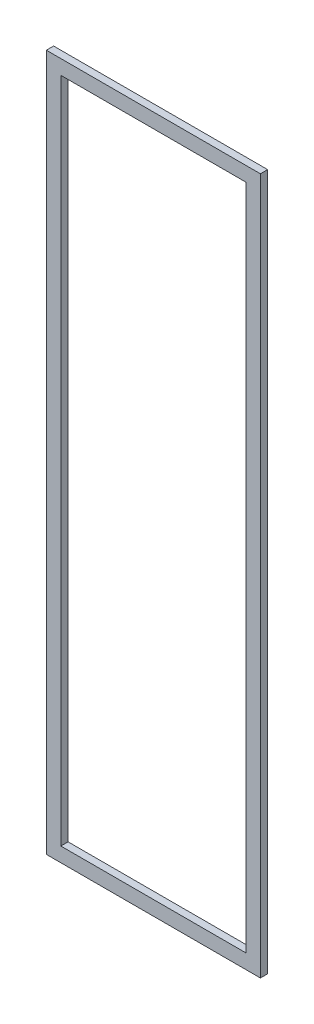
ISO-10303-21;
HEADER;
FILE_DESCRIPTION(('STEP AP214'),'2;1');
FILE_NAME('part.step','',(''),(''),'','','');
FILE_SCHEMA(('AUTOMOTIVE_DESIGN { 1 0 10303 214 1 1 1 1 }'));
ENDSEC;
DATA;
#1=APPLICATION_CONTEXT('core data for automotive mechanical design processes');
#2=APPLICATION_PROTOCOL_DEFINITION('international standard','automotive_design',2000,#1);
#3=PRODUCT_CONTEXT('',#1,'mechanical');
#4=PRODUCT('Part','Part','',(#3));
#5=PRODUCT_RELATED_PRODUCT_CATEGORY('part','',(#4));
#6=PRODUCT_DEFINITION_FORMATION('','',#4);
#7=PRODUCT_DEFINITION_CONTEXT('part definition',#1,'design');
#8=PRODUCT_DEFINITION('design','',#6,#7);
#9=PRODUCT_DEFINITION_SHAPE('','',#8);
#10=(LENGTH_UNIT() NAMED_UNIT(*) SI_UNIT(.MILLI.,.METRE.));
#11=(NAMED_UNIT(*) PLANE_ANGLE_UNIT() SI_UNIT($,.RADIAN.));
#12=(NAMED_UNIT(*) SI_UNIT($,.STERADIAN.) SOLID_ANGLE_UNIT());
#13=UNCERTAINTY_MEASURE_WITH_UNIT(LENGTH_MEASURE(1.E-05),#10,'distance_accuracy_value','');
#14=(GEOMETRIC_REPRESENTATION_CONTEXT(3) GLOBAL_UNCERTAINTY_ASSIGNED_CONTEXT((#13)) GLOBAL_UNIT_ASSIGNED_CONTEXT((#10,
#11,#12)) REPRESENTATION_CONTEXT('',''));
#15=CARTESIAN_POINT('',(0.,0.,0.));
#16=DIRECTION('',(0.,0.,1.));
#17=DIRECTION('',(1.,0.,0.));
#18=AXIS2_PLACEMENT_3D('',#15,#16,#17);
#19=CARTESIAN_POINT('',(0.,0.,25.4));
#20=DIRECTION('',(0.,0.,1.));
#21=DIRECTION('',(1.,0.,0.));
#22=AXIS2_PLACEMENT_3D('',#19,#20,#21);
#23=PLANE('',#22);
#24=DIRECTION('',(0.,-1.,0.));
#25=VECTOR('',#24,1.);
#26=CARTESIAN_POINT('',(0.,0.,25.4));
#27=LINE('',#26,#25);
#28=CARTESIAN_POINT('',(0.,0.,25.4));
#29=VERTEX_POINT('',#28);
#30=CARTESIAN_POINT('',(2.98813818991954E-13,-2440.,25.4));
#31=VERTEX_POINT('',#30);
#32=EDGE_CURVE('E136',#29,#31,#27,.T.);
#33=ORIENTED_EDGE('',*,*,#32,.T.);
#34=DIRECTION('',(1.,0.,0.));
#35=VECTOR('',#34,1.);
#36=CARTESIAN_POINT('',(2.98813818991954E-13,-2440.,25.4));
#37=LINE('',#36,#35);
#38=CARTESIAN_POINT('',(750.,-2440.,25.4));
#39=VERTEX_POINT('',#38);
#40=EDGE_CURVE('E139',#31,#39,#37,.T.);
#41=ORIENTED_EDGE('',*,*,#40,.T.);
#42=DIRECTION('',(0.,1.,0.));
#43=VECTOR('',#42,1.);
#44=CARTESIAN_POINT('',(750.,0.,25.4));
#45=LINE('',#44,#43);
#46=CARTESIAN_POINT('',(750.,0.,25.4));
#47=VERTEX_POINT('',#46);
#48=EDGE_CURVE('E142',#39,#47,#45,.T.);
#49=ORIENTED_EDGE('',*,*,#48,.T.);
#50=DIRECTION('',(-1.,0.,0.));
#51=VECTOR('',#50,1.);
#52=CARTESIAN_POINT('',(0.,0.,25.4));
#53=LINE('',#52,#51);
#54=EDGE_CURVE('E144',#47,#29,#53,.T.);
#55=ORIENTED_EDGE('',*,*,#54,.T.);
#56=EDGE_LOOP('',(#33,#41,#49,#55));
#57=FACE_BOUND('',#56,.T.);
#58=DIRECTION('',(1.,0.,0.));
#59=VECTOR('',#58,1.);
#60=CARTESIAN_POINT('',(50.8000000000003,-2389.2,25.4));
#61=LINE('',#60,#59);
#62=CARTESIAN_POINT('',(50.8000000000003,-2389.2,25.4));
#63=VERTEX_POINT('',#62);
#64=CARTESIAN_POINT('',(699.2,-2389.2,25.4));
#65=VERTEX_POINT('',#64);
#66=EDGE_CURVE('E108',#63,#65,#61,.T.);
#67=ORIENTED_EDGE('',*,*,#66,.F.);
#68=DIRECTION('',(0.,-1.,0.));
#69=VECTOR('',#68,1.);
#70=CARTESIAN_POINT('',(50.8,-50.8,25.4));
#71=LINE('',#70,#69);
#72=CARTESIAN_POINT('',(50.8,-50.8,25.4));
#73=VERTEX_POINT('',#72);
#74=EDGE_CURVE('E100',#73,#63,#71,.T.);
#75=ORIENTED_EDGE('',*,*,#74,.F.);
#76=DIRECTION('',(-1.,0.,0.));
#77=VECTOR('',#76,1.);
#78=CARTESIAN_POINT('',(50.8,-50.8,25.4));
#79=LINE('',#78,#77);
#80=CARTESIAN_POINT('',(699.2,-50.8,25.4));
#81=VERTEX_POINT('',#80);
#82=EDGE_CURVE('E122',#81,#73,#79,.T.);
#83=ORIENTED_EDGE('',*,*,#82,.F.);
#84=DIRECTION('',(0.,1.,0.));
#85=VECTOR('',#84,1.);
#86=CARTESIAN_POINT('',(699.2,-50.8,25.4));
#87=LINE('',#86,#85);
#88=EDGE_CURVE('E120',#65,#81,#87,.T.);
#89=ORIENTED_EDGE('',*,*,#88,.F.);
#90=EDGE_LOOP('',(#67,#75,#83,#89));
#91=FACE_BOUND('',#90,.T.);
#92=ADVANCED_FACE('F35',(#57,#91),#23,.T.);
#93=CARTESIAN_POINT('',(0.,0.,0.));
#94=DIRECTION('',(0.,0.,1.));
#95=DIRECTION('',(1.,0.,0.));
#96=AXIS2_PLACEMENT_3D('',#93,#94,#95);
#97=PLANE('',#96);
#98=DIRECTION('',(0.,-1.,0.));
#99=VECTOR('',#98,1.);
#100=CARTESIAN_POINT('',(0.,0.,0.));
#101=LINE('',#100,#99);
#102=CARTESIAN_POINT('',(0.,0.,0.));
#103=VERTEX_POINT('',#102);
#104=CARTESIAN_POINT('',(2.98813818991954E-13,-2440.,0.));
#105=VERTEX_POINT('',#104);
#106=EDGE_CURVE('E116',#103,#105,#101,.T.);
#107=ORIENTED_EDGE('',*,*,#106,.F.);
#108=DIRECTION('',(-1.,0.,0.));
#109=VECTOR('',#108,1.);
#110=CARTESIAN_POINT('',(0.,0.,0.));
#111=LINE('',#110,#109);
#112=CARTESIAN_POINT('',(750.,0.,0.));
#113=VERTEX_POINT('',#112);
#114=EDGE_CURVE('E140',#113,#103,#111,.T.);
#115=ORIENTED_EDGE('',*,*,#114,.F.);
#116=DIRECTION('',(0.,1.,0.));
#117=VECTOR('',#116,1.);
#118=CARTESIAN_POINT('',(750.,0.,0.));
#119=LINE('',#118,#117);
#120=CARTESIAN_POINT('',(750.,-2440.,0.));
#121=VERTEX_POINT('',#120);
#122=EDGE_CURVE('E151',#121,#113,#119,.T.);
#123=ORIENTED_EDGE('',*,*,#122,.F.);
#124=DIRECTION('',(1.,0.,0.));
#125=VECTOR('',#124,1.);
#126=CARTESIAN_POINT('',(2.98813818991954E-13,-2440.,0.));
#127=LINE('',#126,#125);
#128=EDGE_CURVE('E149',#105,#121,#127,.T.);
#129=ORIENTED_EDGE('',*,*,#128,.F.);
#130=EDGE_LOOP('',(#107,#115,#123,#129));
#131=FACE_BOUND('',#130,.T.);
#132=DIRECTION('',(0.,-1.,0.));
#133=VECTOR('',#132,1.);
#134=CARTESIAN_POINT('',(50.8,-50.8,0.));
#135=LINE('',#134,#133);
#136=CARTESIAN_POINT('',(50.8,-50.8,0.));
#137=VERTEX_POINT('',#136);
#138=CARTESIAN_POINT('',(50.8000000000003,-2389.2,0.));
#139=VERTEX_POINT('',#138);
#140=EDGE_CURVE('E58',#137,#139,#135,.T.);
#141=ORIENTED_EDGE('',*,*,#140,.T.);
#142=DIRECTION('',(1.,0.,0.));
#143=VECTOR('',#142,1.);
#144=CARTESIAN_POINT('',(50.8000000000003,-2389.2,0.));
#145=LINE('',#144,#143);
#146=CARTESIAN_POINT('',(699.2,-2389.2,0.));
#147=VERTEX_POINT('',#146);
#148=EDGE_CURVE('E115',#139,#147,#145,.T.);
#149=ORIENTED_EDGE('',*,*,#148,.T.);
#150=DIRECTION('',(0.,1.,0.));
#151=VECTOR('',#150,1.);
#152=CARTESIAN_POINT('',(699.2,-50.8,0.));
#153=LINE('',#152,#151);
#154=CARTESIAN_POINT('',(699.2,-50.8,0.));
#155=VERTEX_POINT('',#154);
#156=EDGE_CURVE('E128',#147,#155,#153,.T.);
#157=ORIENTED_EDGE('',*,*,#156,.T.);
#158=DIRECTION('',(-1.,0.,0.));
#159=VECTOR('',#158,1.);
#160=CARTESIAN_POINT('',(50.8,-50.8,0.));
#161=LINE('',#160,#159);
#162=EDGE_CURVE('E109',#155,#137,#161,.T.);
#163=ORIENTED_EDGE('',*,*,#162,.T.);
#164=EDGE_LOOP('',(#141,#149,#157,#163));
#165=FACE_BOUND('',#164,.T.);
#166=ADVANCED_FACE('F169',(#131,#165),#97,.F.);
#167=CARTESIAN_POINT('',(0.,0.,25.4));
#168=DIRECTION('',(1.,0.,0.));
#169=DIRECTION('',(0.,1.,0.));
#170=AXIS2_PLACEMENT_3D('',#167,#168,#169);
#171=PLANE('',#170);
#172=ORIENTED_EDGE('',*,*,#106,.T.);
#173=DIRECTION('',(0.,0.,-1.));
#174=VECTOR('',#173,1.);
#175=CARTESIAN_POINT('',(2.98813818991954E-13,-2440.,25.4));
#176=LINE('',#175,#174);
#177=EDGE_CURVE('E11',#31,#105,#176,.T.);
#178=ORIENTED_EDGE('',*,*,#177,.F.);
#179=ORIENTED_EDGE('',*,*,#32,.F.);
#180=DIRECTION('',(0.,0.,-1.));
#181=VECTOR('',#180,1.);
#182=CARTESIAN_POINT('',(0.,0.,25.4));
#183=LINE('',#182,#181);
#184=EDGE_CURVE('E146',#29,#103,#183,.T.);
#185=ORIENTED_EDGE('',*,*,#184,.T.);
#186=EDGE_LOOP('',(#172,#178,#179,#185));
#187=FACE_BOUND('',#186,.T.);
#188=ADVANCED_FACE('F37',(#187),#171,.F.);
#189=CARTESIAN_POINT('',(2.98813818991954E-13,-2440.,25.4));
#190=DIRECTION('',(0.,1.,0.));
#191=DIRECTION('',(0.,0.,1.));
#192=AXIS2_PLACEMENT_3D('',#189,#190,#191);
#193=PLANE('',#192);
#194=ORIENTED_EDGE('',*,*,#128,.T.);
#195=DIRECTION('',(0.,0.,-1.));
#196=VECTOR('',#195,1.);
#197=CARTESIAN_POINT('',(750.,-2440.,25.4));
#198=LINE('',#197,#196);
#199=EDGE_CURVE('E43',#39,#121,#198,.T.);
#200=ORIENTED_EDGE('',*,*,#199,.F.);
#201=ORIENTED_EDGE('',*,*,#40,.F.);
#202=ORIENTED_EDGE('',*,*,#177,.T.);
#203=EDGE_LOOP('',(#194,#200,#201,#202));
#204=FACE_BOUND('',#203,.T.);
#205=ADVANCED_FACE('F179',(#204),#193,.F.);
#206=CARTESIAN_POINT('',(750.,0.,25.4));
#207=DIRECTION('',(-1.,0.,0.));
#208=DIRECTION('',(0.,-1.,0.));
#209=AXIS2_PLACEMENT_3D('',#206,#207,#208);
#210=PLANE('',#209);
#211=ORIENTED_EDGE('',*,*,#122,.T.);
#212=DIRECTION('',(0.,0.,-1.));
#213=VECTOR('',#212,1.);
#214=CARTESIAN_POINT('',(750.,0.,25.4));
#215=LINE('',#214,#213);
#216=EDGE_CURVE('E156',#47,#113,#215,.T.);
#217=ORIENTED_EDGE('',*,*,#216,.F.);
#218=ORIENTED_EDGE('',*,*,#48,.F.);
#219=ORIENTED_EDGE('',*,*,#199,.T.);
#220=EDGE_LOOP('',(#211,#217,#218,#219));
#221=FACE_BOUND('',#220,.T.);
#222=ADVANCED_FACE('F163',(#221),#210,.F.);
#223=CARTESIAN_POINT('',(0.,0.,25.4));
#224=DIRECTION('',(0.,-1.,0.));
#225=DIRECTION('',(0.,0.,-1.));
#226=AXIS2_PLACEMENT_3D('',#223,#224,#225);
#227=PLANE('',#226);
#228=ORIENTED_EDGE('',*,*,#114,.T.);
#229=ORIENTED_EDGE('',*,*,#184,.F.);
#230=ORIENTED_EDGE('',*,*,#54,.F.);
#231=ORIENTED_EDGE('',*,*,#216,.T.);
#232=EDGE_LOOP('',(#228,#229,#230,#231));
#233=FACE_BOUND('',#232,.T.);
#234=ADVANCED_FACE('F173',(#233),#227,.F.);
#235=CARTESIAN_POINT('',(50.8,-50.8,25.4));
#236=DIRECTION('',(1.,0.,0.));
#237=DIRECTION('',(0.,1.,0.));
#238=AXIS2_PLACEMENT_3D('',#235,#236,#237);
#239=PLANE('',#238);
#240=ORIENTED_EDGE('',*,*,#140,.F.);
#241=DIRECTION('',(0.,0.,-1.));
#242=VECTOR('',#241,1.);
#243=CARTESIAN_POINT('',(50.8,-50.8,25.4));
#244=LINE('',#243,#242);
#245=EDGE_CURVE('E104',#73,#137,#244,.T.);
#246=ORIENTED_EDGE('',*,*,#245,.F.);
#247=ORIENTED_EDGE('',*,*,#74,.T.);
#248=DIRECTION('',(0.,0.,-1.));
#249=VECTOR('',#248,1.);
#250=CARTESIAN_POINT('',(50.8000000000003,-2389.2,25.4));
#251=LINE('',#250,#249);
#252=EDGE_CURVE('E103',#63,#139,#251,.T.);
#253=ORIENTED_EDGE('',*,*,#252,.T.);
#254=EDGE_LOOP('',(#240,#246,#247,#253));
#255=FACE_BOUND('',#254,.T.);
#256=ADVANCED_FACE('F102',(#255),#239,.T.);
#257=CARTESIAN_POINT('',(50.8000000000003,-2389.2,25.4));
#258=DIRECTION('',(0.,1.,0.));
#259=DIRECTION('',(0.,0.,1.));
#260=AXIS2_PLACEMENT_3D('',#257,#258,#259);
#261=PLANE('',#260);
#262=ORIENTED_EDGE('',*,*,#148,.F.);
#263=ORIENTED_EDGE('',*,*,#252,.F.);
#264=ORIENTED_EDGE('',*,*,#66,.T.);
#265=DIRECTION('',(0.,0.,-1.));
#266=VECTOR('',#265,1.);
#267=CARTESIAN_POINT('',(699.2,-2389.2,25.4));
#268=LINE('',#267,#266);
#269=EDGE_CURVE('E117',#65,#147,#268,.T.);
#270=ORIENTED_EDGE('',*,*,#269,.T.);
#271=EDGE_LOOP('',(#262,#263,#264,#270));
#272=FACE_BOUND('',#271,.T.);
#273=ADVANCED_FACE('F112',(#272),#261,.T.);
#274=CARTESIAN_POINT('',(699.2,-50.8,25.4));
#275=DIRECTION('',(-1.,0.,0.));
#276=DIRECTION('',(0.,-1.,0.));
#277=AXIS2_PLACEMENT_3D('',#274,#275,#276);
#278=PLANE('',#277);
#279=ORIENTED_EDGE('',*,*,#156,.F.);
#280=ORIENTED_EDGE('',*,*,#269,.F.);
#281=ORIENTED_EDGE('',*,*,#88,.T.);
#282=DIRECTION('',(0.,0.,-1.));
#283=VECTOR('',#282,1.);
#284=CARTESIAN_POINT('',(699.2,-50.8,25.4));
#285=LINE('',#284,#283);
#286=EDGE_CURVE('E50',#81,#155,#285,.T.);
#287=ORIENTED_EDGE('',*,*,#286,.T.);
#288=EDGE_LOOP('',(#279,#280,#281,#287));
#289=FACE_BOUND('',#288,.T.);
#290=ADVANCED_FACE('F202',(#289),#278,.T.);
#291=CARTESIAN_POINT('',(50.8,-50.8,25.4));
#292=DIRECTION('',(0.,-1.,0.));
#293=DIRECTION('',(0.,0.,-1.));
#294=AXIS2_PLACEMENT_3D('',#291,#292,#293);
#295=PLANE('',#294);
#296=ORIENTED_EDGE('',*,*,#162,.F.);
#297=ORIENTED_EDGE('',*,*,#286,.F.);
#298=ORIENTED_EDGE('',*,*,#82,.T.);
#299=ORIENTED_EDGE('',*,*,#245,.T.);
#300=EDGE_LOOP('',(#296,#297,#298,#299));
#301=FACE_BOUND('',#300,.T.);
#302=ADVANCED_FACE('F206',(#301),#295,.T.);
#303=CLOSED_SHELL('',(#92,#166,#188,#205,#222,#234,#256,#273,#290,#302));
#304=MANIFOLD_SOLID_BREP('B2',#303);
#305=ADVANCED_BREP_SHAPE_REPRESENTATION('',(#18,#304),#14);
#306=SHAPE_DEFINITION_REPRESENTATION(#9,#305);
ENDSEC;
END-ISO-10303-21;
